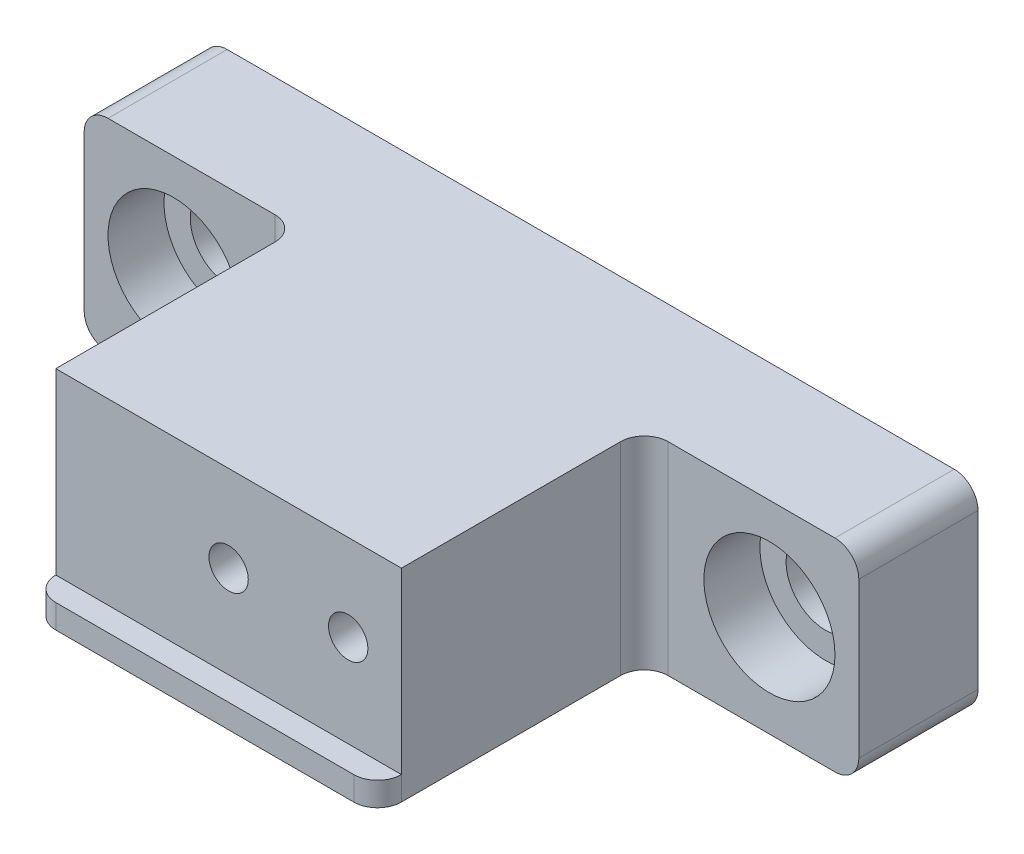
ISO-10303-21;
HEADER;
FILE_DESCRIPTION(('STEP AP214'),'2;1');
FILE_NAME('part.step','',(''),(''),'','','');
FILE_SCHEMA(('AUTOMOTIVE_DESIGN { 1 0 10303 214 1 1 1 1 }'));
ENDSEC;
DATA;
#1=APPLICATION_CONTEXT('core data for automotive mechanical design processes');
#2=APPLICATION_PROTOCOL_DEFINITION('international standard','automotive_design',2000,#1);
#3=PRODUCT_CONTEXT('',#1,'mechanical');
#4=PRODUCT('Part','Part','',(#3));
#5=PRODUCT_RELATED_PRODUCT_CATEGORY('part','',(#4));
#6=PRODUCT_DEFINITION_FORMATION('','',#4);
#7=PRODUCT_DEFINITION_CONTEXT('part definition',#1,'design');
#8=PRODUCT_DEFINITION('design','',#6,#7);
#9=PRODUCT_DEFINITION_SHAPE('','',#8);
#10=(LENGTH_UNIT() NAMED_UNIT(*) SI_UNIT(.MILLI.,.METRE.));
#11=(NAMED_UNIT(*) PLANE_ANGLE_UNIT() SI_UNIT($,.RADIAN.));
#12=(NAMED_UNIT(*) SI_UNIT($,.STERADIAN.) SOLID_ANGLE_UNIT());
#13=UNCERTAINTY_MEASURE_WITH_UNIT(LENGTH_MEASURE(1.E-05),#10,'distance_accuracy_value','');
#14=(GEOMETRIC_REPRESENTATION_CONTEXT(3) GLOBAL_UNCERTAINTY_ASSIGNED_CONTEXT((#13)) GLOBAL_UNIT_ASSIGNED_CONTEXT((#10,
#11,#12)) REPRESENTATION_CONTEXT('',''));
#15=CARTESIAN_POINT('',(0.,0.,0.));
#16=DIRECTION('',(0.,0.,1.));
#17=DIRECTION('',(1.,0.,0.));
#18=AXIS2_PLACEMENT_3D('',#15,#16,#17);
#19=CARTESIAN_POINT('',(0.,0.,10.));
#20=DIRECTION('',(0.,0.,1.));
#21=DIRECTION('',(1.,0.,0.));
#22=AXIS2_PLACEMENT_3D('',#19,#20,#21);
#23=PLANE('',#22);
#24=CARTESIAN_POINT('',(10.033,-5.25299999999997,10.));
#25=DIRECTION('',(0.,0.,1.));
#26=DIRECTION('',(1.,0.,0.));
#27=AXIS2_PLACEMENT_3D('',#24,#25,#26);
#28=CIRCLE('',#27,1.65);
#29=CARTESIAN_POINT('',(11.683,-5.25299999999997,10.));
#30=VERTEX_POINT('',#29);
#31=EDGE_CURVE('E214',#30,#30,#28,.T.);
#32=ORIENTED_EDGE('',*,*,#31,.F.);
#33=EDGE_LOOP('',(#32));
#34=FACE_BOUND('',#33,.T.);
#35=CARTESIAN_POINT('',(0.,-5.25299999999997,10.));
#36=DIRECTION('',(0.,0.,1.));
#37=DIRECTION('',(1.,0.,0.));
#38=AXIS2_PLACEMENT_3D('',#35,#36,#37);
#39=CIRCLE('',#38,1.65);
#40=CARTESIAN_POINT('',(1.65,-5.25299999999997,10.));
#41=VERTEX_POINT('',#40);
#42=EDGE_CURVE('E213',#41,#41,#39,.T.);
#43=ORIENTED_EDGE('',*,*,#42,.F.);
#44=EDGE_LOOP('',(#43));
#45=FACE_BOUND('',#44,.T.);
#46=DIRECTION('',(0.,1.,0.));
#47=VECTOR('',#46,1.);
#48=CARTESIAN_POINT('',(-14.5,-15.,10.));
#49=LINE('',#48,#47);
#50=CARTESIAN_POINT('',(-14.5,-13.,10.));
#51=VERTEX_POINT('',#50);
#52=CARTESIAN_POINT('',(-14.5,2.,10.));
#53=VERTEX_POINT('',#52);
#54=EDGE_CURVE('E306',#51,#53,#49,.T.);
#55=ORIENTED_EDGE('',*,*,#54,.F.);
#56=DIRECTION('',(1.,0.,0.));
#57=VECTOR('',#56,1.);
#58=CARTESIAN_POINT('',(-14.5,-13.,10.));
#59=LINE('',#58,#57);
#60=CARTESIAN_POINT('',(14.5,-13.,10.));
#61=VERTEX_POINT('',#60);
#62=EDGE_CURVE('E225',#51,#61,#59,.T.);
#63=ORIENTED_EDGE('',*,*,#62,.T.);
#64=DIRECTION('',(0.,-1.,0.));
#65=VECTOR('',#64,1.);
#66=CARTESIAN_POINT('',(14.5,-15.,10.));
#67=LINE('',#66,#65);
#68=CARTESIAN_POINT('',(14.5,2.,10.));
#69=VERTEX_POINT('',#68);
#70=EDGE_CURVE('E298',#69,#61,#67,.T.);
#71=ORIENTED_EDGE('',*,*,#70,.F.);
#72=DIRECTION('',(-1.,0.,0.));
#73=VECTOR('',#72,1.);
#74=CARTESIAN_POINT('',(32.5,2.00000000000001,10.));
#75=LINE('',#74,#73);
#76=EDGE_CURVE('E231',#69,#53,#75,.T.);
#77=ORIENTED_EDGE('',*,*,#76,.T.);
#78=EDGE_LOOP('',(#55,#63,#71,#77));
#79=FACE_BOUND('',#78,.T.);
#80=ADVANCED_FACE('F54',(#34,#45,#79),#23,.T.);
#81=CARTESIAN_POINT('',(32.5,0.,10.));
#82=DIRECTION('',(1.,0.,0.));
#83=DIRECTION('',(0.,0.,-1.));
#84=AXIS2_PLACEMENT_3D('',#81,#82,#83);
#85=PLANE('',#84);
#86=DIRECTION('',(0.,1.,0.));
#87=VECTOR('',#86,1.);
#88=CARTESIAN_POINT('',(32.5,-15.,-20.38));
#89=LINE('',#88,#87);
#90=CARTESIAN_POINT('',(32.5,-13.,-20.38));
#91=VERTEX_POINT('',#90);
#92=CARTESIAN_POINT('',(32.5,0.,-20.38));
#93=VERTEX_POINT('',#92);
#94=EDGE_CURVE('E314',#91,#93,#89,.T.);
#95=ORIENTED_EDGE('',*,*,#94,.T.);
#96=DIRECTION('',(0.,0.,1.));
#97=VECTOR('',#96,1.);
#98=CARTESIAN_POINT('',(32.5,0.,10.));
#99=LINE('',#98,#97);
#100=CARTESIAN_POINT('',(32.5,0.,-10.38));
#101=VERTEX_POINT('',#100);
#102=EDGE_CURVE('E342',#93,#101,#99,.T.);
#103=ORIENTED_EDGE('',*,*,#102,.T.);
#104=DIRECTION('',(0.,-1.,0.));
#105=VECTOR('',#104,1.);
#106=CARTESIAN_POINT('',(32.5,-15.,-10.38));
#107=LINE('',#106,#105);
#108=CARTESIAN_POINT('',(32.5,-13.,-10.38));
#109=VERTEX_POINT('',#108);
#110=EDGE_CURVE('E310',#101,#109,#107,.T.);
#111=ORIENTED_EDGE('',*,*,#110,.T.);
#112=DIRECTION('',(0.,0.,-1.));
#113=VECTOR('',#112,1.);
#114=CARTESIAN_POINT('',(32.5,-13.,-20.38));
#115=LINE('',#114,#113);
#116=EDGE_CURVE('E339',#109,#91,#115,.T.);
#117=ORIENTED_EDGE('',*,*,#116,.T.);
#118=EDGE_LOOP('',(#95,#103,#111,#117));
#119=FACE_BOUND('',#118,.T.);
#120=ADVANCED_FACE('F489',(#119),#85,.T.);
#121=CARTESIAN_POINT('',(-32.5,0.,10.));
#122=DIRECTION('',(1.,0.,0.));
#123=DIRECTION('',(0.,0.,-1.));
#124=AXIS2_PLACEMENT_3D('',#121,#122,#123);
#125=PLANE('',#124);
#126=DIRECTION('',(0.,1.,0.));
#127=VECTOR('',#126,1.);
#128=CARTESIAN_POINT('',(-32.5,-15.,-10.38));
#129=LINE('',#128,#127);
#130=CARTESIAN_POINT('',(-32.5,-13.,-10.38));
#131=VERTEX_POINT('',#130);
#132=CARTESIAN_POINT('',(-32.5,0.,-10.38));
#133=VERTEX_POINT('',#132);
#134=EDGE_CURVE('E301',#131,#133,#129,.T.);
#135=ORIENTED_EDGE('',*,*,#134,.T.);
#136=DIRECTION('',(0.,0.,1.));
#137=VECTOR('',#136,1.);
#138=CARTESIAN_POINT('',(-32.5,0.,-20.38));
#139=LINE('',#138,#137);
#140=CARTESIAN_POINT('',(-32.5,0.,-20.38));
#141=VERTEX_POINT('',#140);
#142=EDGE_CURVE('E375',#133,#141,#139,.F.);
#143=ORIENTED_EDGE('',*,*,#142,.T.);
#144=DIRECTION('',(0.,-1.,0.));
#145=VECTOR('',#144,1.);
#146=CARTESIAN_POINT('',(-32.5,-15.,-20.38));
#147=LINE('',#146,#145);
#148=CARTESIAN_POINT('',(-32.5,-13.,-20.38));
#149=VERTEX_POINT('',#148);
#150=EDGE_CURVE('E333',#141,#149,#147,.T.);
#151=ORIENTED_EDGE('',*,*,#150,.T.);
#152=DIRECTION('',(0.,0.,-1.));
#153=VECTOR('',#152,1.);
#154=CARTESIAN_POINT('',(-32.5,-13.,10.));
#155=LINE('',#154,#153);
#156=EDGE_CURVE('E373',#149,#131,#155,.F.);
#157=ORIENTED_EDGE('',*,*,#156,.T.);
#158=EDGE_LOOP('',(#135,#143,#151,#157));
#159=FACE_BOUND('',#158,.T.);
#160=ADVANCED_FACE('F448',(#159),#125,.F.);
#161=CARTESIAN_POINT('',(0.,-15.,10.));
#162=DIRECTION('',(0.,1.,0.));
#163=DIRECTION('',(0.,0.,1.));
#164=AXIS2_PLACEMENT_3D('',#161,#162,#163);
#165=PLANE('',#164);
#166=DIRECTION('',(-1.,0.,0.));
#167=VECTOR('',#166,1.);
#168=CARTESIAN_POINT('',(32.5,-15.,-10.38));
#169=LINE('',#168,#167);
#170=CARTESIAN_POINT('',(30.5,-15.,-10.38));
#171=VERTEX_POINT('',#170);
#172=CARTESIAN_POINT('',(16.5,-15.,-10.38));
#173=VERTEX_POINT('',#172);
#174=EDGE_CURVE('E317',#171,#173,#169,.T.);
#175=ORIENTED_EDGE('',*,*,#174,.T.);
#176=CARTESIAN_POINT('',(16.5,-15.,-8.38));
#177=DIRECTION('',(0.,1.,0.));
#178=DIRECTION('',(0.,0.,1.));
#179=AXIS2_PLACEMENT_3D('',#176,#177,#178);
#180=CIRCLE('',#179,2.);
#181=CARTESIAN_POINT('',(14.5,-15.,-8.38));
#182=VERTEX_POINT('',#181);
#183=EDGE_CURVE('E407',#173,#182,#180,.T.);
#184=ORIENTED_EDGE('',*,*,#183,.T.);
#185=DIRECTION('',(0.,0.,1.));
#186=VECTOR('',#185,1.);
#187=CARTESIAN_POINT('',(14.5,-15.,-45.1388368062799));
#188=LINE('',#187,#186);
#189=CARTESIAN_POINT('',(14.5,-15.,10.));
#190=VERTEX_POINT('',#189);
#191=EDGE_CURVE('E318',#182,#190,#188,.T.);
#192=ORIENTED_EDGE('',*,*,#191,.T.);
#193=CARTESIAN_POINT('',(12.5,-15.,10.));
#194=DIRECTION('',(0.,1.,0.));
#195=DIRECTION('',(0.,0.,1.));
#196=AXIS2_PLACEMENT_3D('',#193,#194,#195);
#197=CIRCLE('',#196,2.);
#198=CARTESIAN_POINT('',(12.5,-15.,12.));
#199=VERTEX_POINT('',#198);
#200=EDGE_CURVE('E383',#190,#199,#197,.F.);
#201=ORIENTED_EDGE('',*,*,#200,.T.);
#202=DIRECTION('',(-1.,0.,0.));
#203=VECTOR('',#202,1.);
#204=CARTESIAN_POINT('',(-14.5,-15.,12.));
#205=LINE('',#204,#203);
#206=CARTESIAN_POINT('',(-12.5,-15.,12.));
#207=VERTEX_POINT('',#206);
#208=EDGE_CURVE('E224',#199,#207,#205,.T.);
#209=ORIENTED_EDGE('',*,*,#208,.T.);
#210=CARTESIAN_POINT('',(-12.5,-15.,10.));
#211=DIRECTION('',(0.,1.,0.));
#212=DIRECTION('',(0.,0.,1.));
#213=AXIS2_PLACEMENT_3D('',#210,#211,#212);
#214=CIRCLE('',#213,2.);
#215=CARTESIAN_POINT('',(-14.5,-15.,10.));
#216=VERTEX_POINT('',#215);
#217=EDGE_CURVE('E380',#207,#216,#214,.F.);
#218=ORIENTED_EDGE('',*,*,#217,.T.);
#219=DIRECTION('',(0.,0.,1.));
#220=VECTOR('',#219,1.);
#221=CARTESIAN_POINT('',(-14.5,-15.,-45.1388368062799));
#222=LINE('',#221,#220);
#223=CARTESIAN_POINT('',(-14.5,-15.,-8.38));
#224=VERTEX_POINT('',#223);
#225=EDGE_CURVE('E309',#224,#216,#222,.T.);
#226=ORIENTED_EDGE('',*,*,#225,.F.);
#227=CARTESIAN_POINT('',(-16.5,-15.,-8.38));
#228=DIRECTION('',(0.,1.,0.));
#229=DIRECTION('',(0.,0.,1.));
#230=AXIS2_PLACEMENT_3D('',#227,#228,#229);
#231=CIRCLE('',#230,2.);
#232=CARTESIAN_POINT('',(-16.5,-15.,-10.38));
#233=VERTEX_POINT('',#232);
#234=EDGE_CURVE('E62',#224,#233,#231,.T.);
#235=ORIENTED_EDGE('',*,*,#234,.T.);
#236=DIRECTION('',(-1.,0.,0.));
#237=VECTOR('',#236,1.);
#238=CARTESIAN_POINT('',(-32.5,-15.,-10.38));
#239=LINE('',#238,#237);
#240=CARTESIAN_POINT('',(-30.5,-15.,-10.38));
#241=VERTEX_POINT('',#240);
#242=EDGE_CURVE('E305',#233,#241,#239,.T.);
#243=ORIENTED_EDGE('',*,*,#242,.T.);
#244=DIRECTION('',(0.,0.,-1.));
#245=VECTOR('',#244,1.);
#246=CARTESIAN_POINT('',(-30.5,-15.,10.));
#247=LINE('',#246,#245);
#248=CARTESIAN_POINT('',(-30.5,-15.,-20.38));
#249=VERTEX_POINT('',#248);
#250=EDGE_CURVE('E363',#241,#249,#247,.T.);
#251=ORIENTED_EDGE('',*,*,#250,.T.);
#252=DIRECTION('',(1.,0.,0.));
#253=VECTOR('',#252,1.);
#254=CARTESIAN_POINT('',(32.5,-15.,-20.38));
#255=LINE('',#254,#253);
#256=CARTESIAN_POINT('',(30.5,-15.,-20.38));
#257=VERTEX_POINT('',#256);
#258=EDGE_CURVE('E336',#249,#257,#255,.T.);
#259=ORIENTED_EDGE('',*,*,#258,.T.);
#260=DIRECTION('',(0.,0.,-1.));
#261=VECTOR('',#260,1.);
#262=CARTESIAN_POINT('',(30.5,-15.,-10.38));
#263=LINE('',#262,#261);
#264=EDGE_CURVE('E366',#257,#171,#263,.F.);
#265=ORIENTED_EDGE('',*,*,#264,.T.);
#266=EDGE_LOOP('',(#175,#184,#192,#201,#209,#218,#226,#235,#243,#251,#259,#265));
#267=FACE_BOUND('',#266,.T.);
#268=ADVANCED_FACE('F410',(#267),#165,.F.);
#269=CARTESIAN_POINT('',(32.5,2.,-20.38));
#270=DIRECTION('',(0.,1.,0.));
#271=DIRECTION('',(-1.,0.,0.));
#272=AXIS2_PLACEMENT_3D('',#269,#270,#271);
#273=PLANE('',#272);
#274=DIRECTION('',(0.,0.,1.));
#275=VECTOR('',#274,1.);
#276=CARTESIAN_POINT('',(14.5,2.,-45.1388368062799));
#277=LINE('',#276,#275);
#278=CARTESIAN_POINT('',(14.5,2.,-8.38));
#279=VERTEX_POINT('',#278);
#280=EDGE_CURVE('E323',#279,#69,#277,.T.);
#281=ORIENTED_EDGE('',*,*,#280,.F.);
#282=CARTESIAN_POINT('',(16.5,2.,-8.38));
#283=DIRECTION('',(0.,1.,0.));
#284=DIRECTION('',(-1.,0.,0.));
#285=AXIS2_PLACEMENT_3D('',#282,#283,#284);
#286=CIRCLE('',#285,2.);
#287=CARTESIAN_POINT('',(16.5,2.,-10.38));
#288=VERTEX_POINT('',#287);
#289=EDGE_CURVE('E405',#279,#288,#286,.F.);
#290=ORIENTED_EDGE('',*,*,#289,.T.);
#291=DIRECTION('',(1.,0.,0.));
#292=VECTOR('',#291,1.);
#293=CARTESIAN_POINT('',(32.5,2.00000000000001,-10.38));
#294=LINE('',#293,#292);
#295=CARTESIAN_POINT('',(30.5,2.00000000000001,-10.38));
#296=VERTEX_POINT('',#295);
#297=EDGE_CURVE('E315',#288,#296,#294,.T.);
#298=ORIENTED_EDGE('',*,*,#297,.T.);
#299=DIRECTION('',(0.,0.,1.));
#300=VECTOR('',#299,1.);
#301=CARTESIAN_POINT('',(30.5,2.,-20.38));
#302=LINE('',#301,#300);
#303=CARTESIAN_POINT('',(30.5,2.,-20.38));
#304=VERTEX_POINT('',#303);
#305=EDGE_CURVE('E353',#296,#304,#302,.F.);
#306=ORIENTED_EDGE('',*,*,#305,.T.);
#307=DIRECTION('',(-1.,0.,0.));
#308=VECTOR('',#307,1.);
#309=CARTESIAN_POINT('',(32.5,2.,-20.38));
#310=LINE('',#309,#308);
#311=CARTESIAN_POINT('',(-30.5,1.99999999999999,-20.38));
#312=VERTEX_POINT('',#311);
#313=EDGE_CURVE('E330',#304,#312,#310,.T.);
#314=ORIENTED_EDGE('',*,*,#313,.T.);
#315=DIRECTION('',(0.,0.,1.));
#316=VECTOR('',#315,1.);
#317=CARTESIAN_POINT('',(-30.5,1.99999999999999,-10.38));
#318=LINE('',#317,#316);
#319=CARTESIAN_POINT('',(-30.5,2.,-10.38));
#320=VERTEX_POINT('',#319);
#321=EDGE_CURVE('E350',#312,#320,#318,.T.);
#322=ORIENTED_EDGE('',*,*,#321,.T.);
#323=DIRECTION('',(1.,0.,0.));
#324=VECTOR('',#323,1.);
#325=CARTESIAN_POINT('',(-32.5,2.,-10.38));
#326=LINE('',#325,#324);
#327=CARTESIAN_POINT('',(-16.5,2.,-10.38));
#328=VERTEX_POINT('',#327);
#329=EDGE_CURVE('E299',#320,#328,#326,.T.);
#330=ORIENTED_EDGE('',*,*,#329,.T.);
#331=CARTESIAN_POINT('',(-16.5,1.99999999999999,-8.38));
#332=DIRECTION('',(0.,1.,0.));
#333=DIRECTION('',(-1.,0.,0.));
#334=AXIS2_PLACEMENT_3D('',#331,#332,#333);
#335=CIRCLE('',#334,2.);
#336=CARTESIAN_POINT('',(-14.5,2.,-8.38));
#337=VERTEX_POINT('',#336);
#338=EDGE_CURVE('E14',#328,#337,#335,.F.);
#339=ORIENTED_EDGE('',*,*,#338,.T.);
#340=DIRECTION('',(0.,0.,1.));
#341=VECTOR('',#340,1.);
#342=CARTESIAN_POINT('',(-14.5,2.,-45.1388368062799));
#343=LINE('',#342,#341);
#344=EDGE_CURVE('E302',#337,#53,#343,.T.);
#345=ORIENTED_EDGE('',*,*,#344,.T.);
#346=ORIENTED_EDGE('',*,*,#76,.F.);
#347=EDGE_LOOP('',(#281,#290,#298,#306,#314,#322,#330,#339,#345,#346));
#348=FACE_BOUND('',#347,.T.);
#349=ADVANCED_FACE('F423',(#348),#273,.T.);
#350=CARTESIAN_POINT('',(0.,0.,-20.38));
#351=DIRECTION('',(0.,0.,1.));
#352=DIRECTION('',(1.,0.,0.));
#353=AXIS2_PLACEMENT_3D('',#350,#351,#352);
#354=PLANE('',#353);
#355=DIRECTION('',(-1.,0.,0.));
#356=VECTOR('',#355,1.);
#357=CARTESIAN_POINT('',(-14.5,-8.5,-20.38));
#358=LINE('',#357,#356);
#359=CARTESIAN_POINT('',(-14.5,-8.5,-20.38));
#360=VERTEX_POINT('',#359);
#361=CARTESIAN_POINT('',(-15.5,-8.5,-20.38));
#362=VERTEX_POINT('',#361);
#363=EDGE_CURVE('E252',#360,#362,#358,.T.);
#364=ORIENTED_EDGE('',*,*,#363,.F.);
#365=CARTESIAN_POINT('',(-14.5,-6.5,-20.38));
#366=DIRECTION('',(0.,0.,-1.));
#367=DIRECTION('',(-1.,0.,0.));
#368=AXIS2_PLACEMENT_3D('',#365,#366,#367);
#369=CIRCLE('',#368,2.);
#370=CARTESIAN_POINT('',(-14.5,-4.5,-20.38));
#371=VERTEX_POINT('',#370);
#372=EDGE_CURVE('E236',#371,#360,#369,.T.);
#373=ORIENTED_EDGE('',*,*,#372,.F.);
#374=DIRECTION('',(1.,0.,0.));
#375=VECTOR('',#374,1.);
#376=CARTESIAN_POINT('',(-14.5,-4.5,-20.38));
#377=LINE('',#376,#375);
#378=CARTESIAN_POINT('',(-15.5,-4.5,-20.38));
#379=VERTEX_POINT('',#378);
#380=EDGE_CURVE('E241',#379,#371,#377,.T.);
#381=ORIENTED_EDGE('',*,*,#380,.F.);
#382=CARTESIAN_POINT('',(-15.5,-6.5,-20.38));
#383=DIRECTION('',(0.,0.,-1.));
#384=DIRECTION('',(-1.,0.,0.));
#385=AXIS2_PLACEMENT_3D('',#382,#383,#384);
#386=CIRCLE('',#385,2.);
#387=EDGE_CURVE('E255',#362,#379,#386,.T.);
#388=ORIENTED_EDGE('',*,*,#387,.F.);
#389=EDGE_LOOP('',(#364,#373,#381,#388));
#390=FACE_BOUND('',#389,.T.);
#391=CARTESIAN_POINT('',(15.,-6.5,-20.38));
#392=DIRECTION('',(0.,0.,-1.));
#393=DIRECTION('',(-1.,0.,0.));
#394=AXIS2_PLACEMENT_3D('',#391,#392,#393);
#395=CIRCLE('',#394,2.);
#396=CARTESIAN_POINT('',(13.,-6.5,-20.38));
#397=VERTEX_POINT('',#396);
#398=EDGE_CURVE('E262',#397,#397,#395,.T.);
#399=ORIENTED_EDGE('',*,*,#398,.F.);
#400=EDGE_LOOP('',(#399));
#401=FACE_BOUND('',#400,.T.);
#402=CARTESIAN_POINT('',(-25.,-6.50000000000001,-20.38));
#403=DIRECTION('',(0.,0.,1.));
#404=DIRECTION('',(1.,0.,0.));
#405=AXIS2_PLACEMENT_3D('',#402,#403,#404);
#406=CIRCLE('',#405,3.3);
#407=CARTESIAN_POINT('',(-21.7,-6.50000000000001,-20.38));
#408=VERTEX_POINT('',#407);
#409=EDGE_CURVE('E283',#408,#408,#406,.T.);
#410=ORIENTED_EDGE('',*,*,#409,.T.);
#411=EDGE_LOOP('',(#410));
#412=FACE_BOUND('',#411,.T.);
#413=CARTESIAN_POINT('',(25.,-6.5,-20.38));
#414=DIRECTION('',(0.,0.,1.));
#415=DIRECTION('',(1.,0.,0.));
#416=AXIS2_PLACEMENT_3D('',#413,#414,#415);
#417=CIRCLE('',#416,3.3);
#418=CARTESIAN_POINT('',(28.3,-6.5,-20.38));
#419=VERTEX_POINT('',#418);
#420=EDGE_CURVE('E295',#419,#419,#417,.T.);
#421=ORIENTED_EDGE('',*,*,#420,.T.);
#422=EDGE_LOOP('',(#421));
#423=FACE_BOUND('',#422,.T.);
#424=ORIENTED_EDGE('',*,*,#313,.F.);
#425=CARTESIAN_POINT('',(30.5,0.,-20.38));
#426=DIRECTION('',(0.,0.,1.));
#427=DIRECTION('',(1.,0.,0.));
#428=AXIS2_PLACEMENT_3D('',#425,#426,#427);
#429=CIRCLE('',#428,2.);
#430=EDGE_CURVE('E361',#304,#93,#429,.F.);
#431=ORIENTED_EDGE('',*,*,#430,.T.);
#432=ORIENTED_EDGE('',*,*,#94,.F.);
#433=CARTESIAN_POINT('',(30.5,-13.,-20.38));
#434=DIRECTION('',(0.,0.,1.));
#435=DIRECTION('',(1.,0.,0.));
#436=AXIS2_PLACEMENT_3D('',#433,#434,#435);
#437=CIRCLE('',#436,2.);
#438=EDGE_CURVE('E359',#91,#257,#437,.F.);
#439=ORIENTED_EDGE('',*,*,#438,.T.);
#440=ORIENTED_EDGE('',*,*,#258,.F.);
#441=CARTESIAN_POINT('',(-30.5,-13.,-20.38));
#442=DIRECTION('',(0.,0.,1.));
#443=DIRECTION('',(1.,0.,0.));
#444=AXIS2_PLACEMENT_3D('',#441,#442,#443);
#445=CIRCLE('',#444,2.);
#446=EDGE_CURVE('E355',#249,#149,#445,.F.);
#447=ORIENTED_EDGE('',*,*,#446,.T.);
#448=ORIENTED_EDGE('',*,*,#150,.F.);
#449=CARTESIAN_POINT('',(-30.5,0.,-20.38));
#450=DIRECTION('',(0.,0.,1.));
#451=DIRECTION('',(1.,0.,0.));
#452=AXIS2_PLACEMENT_3D('',#449,#450,#451);
#453=CIRCLE('',#452,2.);
#454=EDGE_CURVE('E357',#141,#312,#453,.F.);
#455=ORIENTED_EDGE('',*,*,#454,.T.);
#456=EDGE_LOOP('',(#424,#431,#432,#439,#440,#447,#448,#455));
#457=FACE_BOUND('',#456,.T.);
#458=ADVANCED_FACE('F436',(#390,#401,#412,#423,#457),#354,.F.);
#459=CARTESIAN_POINT('',(14.5,-15.,-45.1388368062799));
#460=DIRECTION('',(-1.,0.,0.));
#461=DIRECTION('',(0.,-1.,0.));
#462=AXIS2_PLACEMENT_3D('',#459,#460,#461);
#463=PLANE('',#462);
#464=ORIENTED_EDGE('',*,*,#191,.F.);
#465=DIRECTION('',(0.,1.,0.));
#466=VECTOR('',#465,1.);
#467=CARTESIAN_POINT('',(14.5,-15.,-8.38));
#468=LINE('',#467,#466);
#469=EDGE_CURVE('E396',#182,#279,#468,.T.);
#470=ORIENTED_EDGE('',*,*,#469,.T.);
#471=ORIENTED_EDGE('',*,*,#280,.T.);
#472=ORIENTED_EDGE('',*,*,#70,.T.);
#473=DIRECTION('',(0.,-1.,0.));
#474=VECTOR('',#473,1.);
#475=CARTESIAN_POINT('',(14.5,-15.,10.));
#476=LINE('',#475,#474);
#477=EDGE_CURVE('E377',#61,#190,#476,.T.);
#478=ORIENTED_EDGE('',*,*,#477,.T.);
#479=EDGE_LOOP('',(#464,#470,#471,#472,#478));
#480=FACE_BOUND('',#479,.T.);
#481=ADVANCED_FACE('F417',(#480),#463,.F.);
#482=CARTESIAN_POINT('',(0.,0.,-10.38));
#483=DIRECTION('',(0.,0.,1.));
#484=DIRECTION('',(1.,0.,0.));
#485=AXIS2_PLACEMENT_3D('',#482,#483,#484);
#486=PLANE('',#485);
#487=CARTESIAN_POINT('',(25.,-6.5,-10.38));
#488=DIRECTION('',(0.,0.,1.));
#489=DIRECTION('',(1.,0.,0.));
#490=AXIS2_PLACEMENT_3D('',#487,#488,#489);
#491=CIRCLE('',#490,5.5);
#492=CARTESIAN_POINT('',(30.5,-6.5,-10.38));
#493=VERTEX_POINT('',#492);
#494=EDGE_CURVE('E286',#493,#493,#491,.T.);
#495=ORIENTED_EDGE('',*,*,#494,.F.);
#496=EDGE_LOOP('',(#495));
#497=FACE_BOUND('',#496,.T.);
#498=ORIENTED_EDGE('',*,*,#297,.F.);
#499=DIRECTION('',(0.,1.,0.));
#500=VECTOR('',#499,1.);
#501=CARTESIAN_POINT('',(16.5,0.,-10.38));
#502=LINE('',#501,#500);
#503=EDGE_CURVE('E399',#288,#173,#502,.F.);
#504=ORIENTED_EDGE('',*,*,#503,.T.);
#505=ORIENTED_EDGE('',*,*,#174,.F.);
#506=CARTESIAN_POINT('',(30.5,-13.,-10.38));
#507=DIRECTION('',(0.,0.,1.));
#508=DIRECTION('',(1.,0.,0.));
#509=AXIS2_PLACEMENT_3D('',#506,#507,#508);
#510=CIRCLE('',#509,2.);
#511=EDGE_CURVE('E345',#171,#109,#510,.T.);
#512=ORIENTED_EDGE('',*,*,#511,.T.);
#513=ORIENTED_EDGE('',*,*,#110,.F.);
#514=CARTESIAN_POINT('',(30.5,0.,-10.38));
#515=DIRECTION('',(0.,0.,1.));
#516=DIRECTION('',(1.,0.,0.));
#517=AXIS2_PLACEMENT_3D('',#514,#515,#516);
#518=CIRCLE('',#517,2.);
#519=EDGE_CURVE('E347',#101,#296,#518,.T.);
#520=ORIENTED_EDGE('',*,*,#519,.T.);
#521=EDGE_LOOP('',(#498,#504,#505,#512,#513,#520));
#522=FACE_BOUND('',#521,.T.);
#523=ADVANCED_FACE('F426',(#497,#522),#486,.T.);
#524=CARTESIAN_POINT('',(-14.5,-15.,-45.1388368062799));
#525=DIRECTION('',(1.,0.,0.));
#526=DIRECTION('',(0.,1.,0.));
#527=AXIS2_PLACEMENT_3D('',#524,#525,#526);
#528=PLANE('',#527);
#529=ORIENTED_EDGE('',*,*,#344,.F.);
#530=DIRECTION('',(0.,-1.,0.));
#531=VECTOR('',#530,1.);
#532=CARTESIAN_POINT('',(-14.5,-15.,-8.38));
#533=LINE('',#532,#531);
#534=EDGE_CURVE('E401',#337,#224,#533,.T.);
#535=ORIENTED_EDGE('',*,*,#534,.T.);
#536=ORIENTED_EDGE('',*,*,#225,.T.);
#537=DIRECTION('',(0.,-1.,0.));
#538=VECTOR('',#537,1.);
#539=CARTESIAN_POINT('',(-14.5,-13.,10.));
#540=LINE('',#539,#538);
#541=EDGE_CURVE('E394',#216,#51,#540,.F.);
#542=ORIENTED_EDGE('',*,*,#541,.T.);
#543=ORIENTED_EDGE('',*,*,#54,.T.);
#544=EDGE_LOOP('',(#529,#535,#536,#542,#543));
#545=FACE_BOUND('',#544,.T.);
#546=ADVANCED_FACE('F457',(#545),#528,.F.);
#547=CARTESIAN_POINT('',(0.,0.,-10.38));
#548=DIRECTION('',(0.,0.,1.));
#549=DIRECTION('',(1.,0.,0.));
#550=AXIS2_PLACEMENT_3D('',#547,#548,#549);
#551=PLANE('',#550);
#552=CARTESIAN_POINT('',(-25.,-6.50000000000001,-10.38));
#553=DIRECTION('',(0.,0.,1.));
#554=DIRECTION('',(1.,0.,0.));
#555=AXIS2_PLACEMENT_3D('',#552,#553,#554);
#556=CIRCLE('',#555,5.5);
#557=CARTESIAN_POINT('',(-19.5,-6.50000000000001,-10.38));
#558=VERTEX_POINT('',#557);
#559=EDGE_CURVE('E274',#558,#558,#556,.T.);
#560=ORIENTED_EDGE('',*,*,#559,.F.);
#561=EDGE_LOOP('',(#560));
#562=FACE_BOUND('',#561,.T.);
#563=ORIENTED_EDGE('',*,*,#242,.F.);
#564=DIRECTION('',(0.,-1.,0.));
#565=VECTOR('',#564,1.);
#566=CARTESIAN_POINT('',(-16.5,0.,-10.38));
#567=LINE('',#566,#565);
#568=EDGE_CURVE('E75',#233,#328,#567,.F.);
#569=ORIENTED_EDGE('',*,*,#568,.T.);
#570=ORIENTED_EDGE('',*,*,#329,.F.);
#571=CARTESIAN_POINT('',(-30.5,0.,-10.38));
#572=DIRECTION('',(0.,0.,1.));
#573=DIRECTION('',(1.,0.,0.));
#574=AXIS2_PLACEMENT_3D('',#571,#572,#573);
#575=CIRCLE('',#574,2.);
#576=EDGE_CURVE('E371',#320,#133,#575,.T.);
#577=ORIENTED_EDGE('',*,*,#576,.T.);
#578=ORIENTED_EDGE('',*,*,#134,.F.);
#579=CARTESIAN_POINT('',(-30.5,-13.,-10.38));
#580=DIRECTION('',(0.,0.,1.));
#581=DIRECTION('',(1.,0.,0.));
#582=AXIS2_PLACEMENT_3D('',#579,#580,#581);
#583=CIRCLE('',#582,2.);
#584=EDGE_CURVE('E368',#131,#241,#583,.T.);
#585=ORIENTED_EDGE('',*,*,#584,.T.);
#586=EDGE_LOOP('',(#563,#569,#570,#577,#578,#585));
#587=FACE_BOUND('',#586,.T.);
#588=ADVANCED_FACE('F444',(#562,#587),#551,.T.);
#589=CARTESIAN_POINT('',(25.,-6.5,-10.38));
#590=DIRECTION('',(0.,0.,1.));
#591=DIRECTION('',(1.,0.,0.));
#592=AXIS2_PLACEMENT_3D('',#589,#590,#591);
#593=CYLINDRICAL_SURFACE('',#592,3.3);
#594=ORIENTED_EDGE('',*,*,#420,.F.);
#595=EDGE_LOOP('',(#594));
#596=FACE_BOUND('',#595,.T.);
#597=CARTESIAN_POINT('',(25.,-6.5,-15.08));
#598=DIRECTION('',(0.,0.,1.));
#599=DIRECTION('',(1.,0.,0.));
#600=AXIS2_PLACEMENT_3D('',#597,#598,#599);
#601=CIRCLE('',#600,3.3);
#602=CARTESIAN_POINT('',(28.3,-6.5,-15.08));
#603=VERTEX_POINT('',#602);
#604=EDGE_CURVE('E292',#603,#603,#601,.T.);
#605=ORIENTED_EDGE('',*,*,#604,.T.);
#606=EDGE_LOOP('',(#605));
#607=FACE_BOUND('',#606,.T.);
#608=ADVANCED_FACE('F539',(#596,#607),#593,.F.);
#609=CARTESIAN_POINT('',(28.3,-6.5,-15.08));
#610=DIRECTION('',(0.,0.,-1.));
#611=DIRECTION('',(-1.,0.,0.));
#612=AXIS2_PLACEMENT_3D('',#609,#610,#611);
#613=PLANE('',#612);
#614=ORIENTED_EDGE('',*,*,#604,.F.);
#615=EDGE_LOOP('',(#614));
#616=FACE_BOUND('',#615,.T.);
#617=CARTESIAN_POINT('',(25.,-6.5,-15.08));
#618=DIRECTION('',(0.,0.,1.));
#619=DIRECTION('',(1.,0.,0.));
#620=AXIS2_PLACEMENT_3D('',#617,#618,#619);
#621=CIRCLE('',#620,5.5);
#622=CARTESIAN_POINT('',(30.5,-6.5,-15.08));
#623=VERTEX_POINT('',#622);
#624=EDGE_CURVE('E289',#623,#623,#621,.T.);
#625=ORIENTED_EDGE('',*,*,#624,.T.);
#626=EDGE_LOOP('',(#625));
#627=FACE_BOUND('',#626,.T.);
#628=ADVANCED_FACE('F801',(#616,#627),#613,.F.);
#629=CARTESIAN_POINT('',(25.,-6.5,-10.38));
#630=DIRECTION('',(0.,0.,1.));
#631=DIRECTION('',(1.,0.,0.));
#632=AXIS2_PLACEMENT_3D('',#629,#630,#631);
#633=CYLINDRICAL_SURFACE('',#632,5.5);
#634=ORIENTED_EDGE('',*,*,#624,.F.);
#635=EDGE_LOOP('',(#634));
#636=FACE_BOUND('',#635,.T.);
#637=ORIENTED_EDGE('',*,*,#494,.T.);
#638=EDGE_LOOP('',(#637));
#639=FACE_BOUND('',#638,.T.);
#640=ADVANCED_FACE('F791',(#636,#639),#633,.F.);
#641=CARTESIAN_POINT('',(-25.,-6.50000000000001,-10.38));
#642=DIRECTION('',(0.,0.,1.));
#643=DIRECTION('',(1.,0.,0.));
#644=AXIS2_PLACEMENT_3D('',#641,#642,#643);
#645=CYLINDRICAL_SURFACE('',#644,3.3);
#646=ORIENTED_EDGE('',*,*,#409,.F.);
#647=EDGE_LOOP('',(#646));
#648=FACE_BOUND('',#647,.T.);
#649=CARTESIAN_POINT('',(-25.,-6.50000000000001,-15.08));
#650=DIRECTION('',(0.,0.,1.));
#651=DIRECTION('',(1.,0.,0.));
#652=AXIS2_PLACEMENT_3D('',#649,#650,#651);
#653=CIRCLE('',#652,3.3);
#654=CARTESIAN_POINT('',(-21.7,-6.50000000000001,-15.08));
#655=VERTEX_POINT('',#654);
#656=EDGE_CURVE('E280',#655,#655,#653,.T.);
#657=ORIENTED_EDGE('',*,*,#656,.T.);
#658=EDGE_LOOP('',(#657));
#659=FACE_BOUND('',#658,.T.);
#660=ADVANCED_FACE('F781',(#648,#659),#645,.F.);
#661=CARTESIAN_POINT('',(-21.7,-6.50000000000001,-15.08));
#662=DIRECTION('',(0.,0.,-1.));
#663=DIRECTION('',(-1.,0.,0.));
#664=AXIS2_PLACEMENT_3D('',#661,#662,#663);
#665=PLANE('',#664);
#666=ORIENTED_EDGE('',*,*,#656,.F.);
#667=EDGE_LOOP('',(#666));
#668=FACE_BOUND('',#667,.T.);
#669=CARTESIAN_POINT('',(-25.,-6.50000000000001,-15.08));
#670=DIRECTION('',(0.,0.,1.));
#671=DIRECTION('',(1.,0.,0.));
#672=AXIS2_PLACEMENT_3D('',#669,#670,#671);
#673=CIRCLE('',#672,5.5);
#674=CARTESIAN_POINT('',(-19.5,-6.50000000000001,-15.08));
#675=VERTEX_POINT('',#674);
#676=EDGE_CURVE('E277',#675,#675,#673,.T.);
#677=ORIENTED_EDGE('',*,*,#676,.T.);
#678=EDGE_LOOP('',(#677));
#679=FACE_BOUND('',#678,.T.);
#680=ADVANCED_FACE('F771',(#668,#679),#665,.F.);
#681=CARTESIAN_POINT('',(-25.,-6.50000000000001,-10.38));
#682=DIRECTION('',(0.,0.,1.));
#683=DIRECTION('',(1.,0.,0.));
#684=AXIS2_PLACEMENT_3D('',#681,#682,#683);
#685=CYLINDRICAL_SURFACE('',#684,5.5);
#686=ORIENTED_EDGE('',*,*,#676,.F.);
#687=EDGE_LOOP('',(#686));
#688=FACE_BOUND('',#687,.T.);
#689=ORIENTED_EDGE('',*,*,#559,.T.);
#690=EDGE_LOOP('',(#689));
#691=FACE_BOUND('',#690,.T.);
#692=ADVANCED_FACE('F761',(#688,#691),#685,.F.);
#693=CARTESIAN_POINT('',(15.,-6.5,-15.38));
#694=DIRECTION('',(0.,0.,-1.));
#695=DIRECTION('',(-1.,0.,0.));
#696=AXIS2_PLACEMENT_3D('',#693,#694,#695);
#697=CONICAL_SURFACE('',#696,2.,1.02974425867665);
#698=CARTESIAN_POINT('',(15.,-6.5,-14.1782787619449));
#699=VERTEX_POINT('',#698);
#700=VERTEX_LOOP('',#699);
#701=FACE_BOUND('',#700,.T.);
#702=CARTESIAN_POINT('',(15.,-6.5,-15.38));
#703=DIRECTION('',(0.,0.,-1.));
#704=DIRECTION('',(-1.,0.,0.));
#705=AXIS2_PLACEMENT_3D('',#702,#703,#704);
#706=CIRCLE('',#705,2.);
#707=CARTESIAN_POINT('',(13.,-6.5,-15.38));
#708=VERTEX_POINT('',#707);
#709=EDGE_CURVE('E271',#708,#708,#706,.T.);
#710=ORIENTED_EDGE('',*,*,#709,.T.);
#711=EDGE_LOOP('',(#710));
#712=FACE_BOUND('',#711,.T.);
#713=ADVANCED_FACE('F751',(#701,#712),#697,.F.);
#714=CARTESIAN_POINT('',(15.,-6.5,-20.38));
#715=DIRECTION('',(0.,0.,-1.));
#716=DIRECTION('',(-1.,0.,0.));
#717=AXIS2_PLACEMENT_3D('',#714,#715,#716);
#718=CYLINDRICAL_SURFACE('',#717,2.);
#719=ORIENTED_EDGE('',*,*,#709,.F.);
#720=EDGE_LOOP('',(#719));
#721=FACE_BOUND('',#720,.T.);
#722=ORIENTED_EDGE('',*,*,#398,.T.);
#723=EDGE_LOOP('',(#722));
#724=FACE_BOUND('',#723,.T.);
#725=ADVANCED_FACE('F741',(#721,#724),#718,.F.);
#726=CARTESIAN_POINT('',(-14.5,-6.5,-15.38));
#727=DIRECTION('',(0.,0.,-1.));
#728=DIRECTION('',(-1.,0.,0.));
#729=AXIS2_PLACEMENT_3D('',#726,#727,#728);
#730=CYLINDRICAL_SURFACE('',#729,2.);
#731=ORIENTED_EDGE('',*,*,#372,.T.);
#732=DIRECTION('',(0.,0.,-1.));
#733=VECTOR('',#732,1.);
#734=CARTESIAN_POINT('',(-14.5,-8.5,-15.38));
#735=LINE('',#734,#733);
#736=CARTESIAN_POINT('',(-14.5,-8.5,-15.38));
#737=VERTEX_POINT('',#736);
#738=EDGE_CURVE('E250',#737,#360,#735,.T.);
#739=ORIENTED_EDGE('',*,*,#738,.F.);
#740=CARTESIAN_POINT('',(-14.5,-6.5,-15.38));
#741=DIRECTION('',(0.,0.,-1.));
#742=DIRECTION('',(-1.,0.,0.));
#743=AXIS2_PLACEMENT_3D('',#740,#741,#742);
#744=CIRCLE('',#743,2.);
#745=CARTESIAN_POINT('',(-14.5,-4.5,-15.38));
#746=VERTEX_POINT('',#745);
#747=EDGE_CURVE('E237',#746,#737,#744,.T.);
#748=ORIENTED_EDGE('',*,*,#747,.F.);
#749=DIRECTION('',(0.,0.,-1.));
#750=VECTOR('',#749,1.);
#751=CARTESIAN_POINT('',(-14.5,-4.5,-15.38));
#752=LINE('',#751,#750);
#753=EDGE_CURVE('E260',#746,#371,#752,.T.);
#754=ORIENTED_EDGE('',*,*,#753,.T.);
#755=EDGE_LOOP('',(#731,#739,#748,#754));
#756=FACE_BOUND('',#755,.T.);
#757=ADVANCED_FACE('F731',(#756),#730,.F.);
#758=CARTESIAN_POINT('',(-14.5,-4.5,-15.38));
#759=DIRECTION('',(0.,1.,0.));
#760=DIRECTION('',(0.,0.,1.));
#761=AXIS2_PLACEMENT_3D('',#758,#759,#760);
#762=PLANE('',#761);
#763=ORIENTED_EDGE('',*,*,#380,.T.);
#764=ORIENTED_EDGE('',*,*,#753,.F.);
#765=DIRECTION('',(1.,0.,0.));
#766=VECTOR('',#765,1.);
#767=CARTESIAN_POINT('',(-14.5,-4.5,-15.38));
#768=LINE('',#767,#766);
#769=CARTESIAN_POINT('',(-15.5,-4.5,-15.38));
#770=VERTEX_POINT('',#769);
#771=EDGE_CURVE('E247',#770,#746,#768,.T.);
#772=ORIENTED_EDGE('',*,*,#771,.F.);
#773=DIRECTION('',(0.,0.,-1.));
#774=VECTOR('',#773,1.);
#775=CARTESIAN_POINT('',(-15.5,-4.5,-15.38));
#776=LINE('',#775,#774);
#777=EDGE_CURVE('E263',#770,#379,#776,.T.);
#778=ORIENTED_EDGE('',*,*,#777,.T.);
#779=EDGE_LOOP('',(#763,#764,#772,#778));
#780=FACE_BOUND('',#779,.T.);
#781=ADVANCED_FACE('F721',(#780),#762,.F.);
#782=CARTESIAN_POINT('',(-15.5,-6.5,-15.38));
#783=DIRECTION('',(0.,0.,-1.));
#784=DIRECTION('',(-1.,0.,0.));
#785=AXIS2_PLACEMENT_3D('',#782,#783,#784);
#786=CYLINDRICAL_SURFACE('',#785,2.);
#787=ORIENTED_EDGE('',*,*,#387,.T.);
#788=ORIENTED_EDGE('',*,*,#777,.F.);
#789=CARTESIAN_POINT('',(-15.5,-6.5,-15.38));
#790=DIRECTION('',(0.,0.,-1.));
#791=DIRECTION('',(-1.,0.,0.));
#792=AXIS2_PLACEMENT_3D('',#789,#790,#791);
#793=CIRCLE('',#792,2.);
#794=CARTESIAN_POINT('',(-15.5,-8.5,-15.38));
#795=VERTEX_POINT('',#794);
#796=EDGE_CURVE('E244',#795,#770,#793,.T.);
#797=ORIENTED_EDGE('',*,*,#796,.F.);
#798=DIRECTION('',(0.,0.,-1.));
#799=VECTOR('',#798,1.);
#800=CARTESIAN_POINT('',(-15.5,-8.5,-15.38));
#801=LINE('',#800,#799);
#802=EDGE_CURVE('E265',#795,#362,#801,.T.);
#803=ORIENTED_EDGE('',*,*,#802,.T.);
#804=EDGE_LOOP('',(#787,#788,#797,#803));
#805=FACE_BOUND('',#804,.T.);
#806=ADVANCED_FACE('F711',(#805),#786,.F.);
#807=CARTESIAN_POINT('',(-14.5,-8.5,-15.38));
#808=DIRECTION('',(0.,-1.,0.));
#809=DIRECTION('',(0.,0.,-1.));
#810=AXIS2_PLACEMENT_3D('',#807,#808,#809);
#811=PLANE('',#810);
#812=ORIENTED_EDGE('',*,*,#363,.T.);
#813=ORIENTED_EDGE('',*,*,#802,.F.);
#814=DIRECTION('',(-1.,0.,0.));
#815=VECTOR('',#814,1.);
#816=CARTESIAN_POINT('',(-14.5,-8.5,-15.38));
#817=LINE('',#816,#815);
#818=EDGE_CURVE('E240',#737,#795,#817,.T.);
#819=ORIENTED_EDGE('',*,*,#818,.F.);
#820=ORIENTED_EDGE('',*,*,#738,.T.);
#821=EDGE_LOOP('',(#812,#813,#819,#820));
#822=FACE_BOUND('',#821,.T.);
#823=ADVANCED_FACE('F700',(#822),#811,.F.);
#824=CARTESIAN_POINT('',(-14.5,-6.5,-15.38));
#825=DIRECTION('',(0.,0.,-1.));
#826=DIRECTION('',(-1.,0.,0.));
#827=AXIS2_PLACEMENT_3D('',#824,#825,#826);
#828=PLANE('',#827);
#829=ORIENTED_EDGE('',*,*,#747,.T.);
#830=ORIENTED_EDGE('',*,*,#818,.T.);
#831=ORIENTED_EDGE('',*,*,#796,.T.);
#832=ORIENTED_EDGE('',*,*,#771,.T.);
#833=EDGE_LOOP('',(#829,#830,#831,#832));
#834=FACE_BOUND('',#833,.T.);
#835=ADVANCED_FACE('F486',(#834),#828,.T.);
#836=CARTESIAN_POINT('',(-14.5,-13.,12.));
#837=DIRECTION('',(0.,0.,1.));
#838=DIRECTION('',(1.,0.,0.));
#839=AXIS2_PLACEMENT_3D('',#836,#837,#838);
#840=PLANE('',#839);
#841=ORIENTED_EDGE('',*,*,#208,.F.);
#842=DIRECTION('',(0.,-1.,0.));
#843=VECTOR('',#842,1.);
#844=CARTESIAN_POINT('',(12.5,-13.,12.));
#845=LINE('',#844,#843);
#846=CARTESIAN_POINT('',(12.5,-13.,12.));
#847=VERTEX_POINT('',#846);
#848=EDGE_CURVE('E388',#199,#847,#845,.F.);
#849=ORIENTED_EDGE('',*,*,#848,.T.);
#850=DIRECTION('',(-1.,0.,0.));
#851=VECTOR('',#850,1.);
#852=CARTESIAN_POINT('',(-14.5,-13.,12.));
#853=LINE('',#852,#851);
#854=CARTESIAN_POINT('',(-12.5,-13.,12.));
#855=VERTEX_POINT('',#854);
#856=EDGE_CURVE('E228',#847,#855,#853,.T.);
#857=ORIENTED_EDGE('',*,*,#856,.T.);
#858=DIRECTION('',(0.,-1.,0.));
#859=VECTOR('',#858,1.);
#860=CARTESIAN_POINT('',(-12.5,-15.,12.));
#861=LINE('',#860,#859);
#862=EDGE_CURVE('E385',#855,#207,#861,.T.);
#863=ORIENTED_EDGE('',*,*,#862,.T.);
#864=EDGE_LOOP('',(#841,#849,#857,#863));
#865=FACE_BOUND('',#864,.T.);
#866=ADVANCED_FACE('F470',(#865),#840,.T.);
#867=CARTESIAN_POINT('',(0.,-13.,0.));
#868=DIRECTION('',(0.,1.,0.));
#869=DIRECTION('',(0.,0.,1.));
#870=AXIS2_PLACEMENT_3D('',#867,#868,#869);
#871=PLANE('',#870);
#872=ORIENTED_EDGE('',*,*,#856,.F.);
#873=CARTESIAN_POINT('',(12.5,-13.,10.));
#874=DIRECTION('',(0.,1.,0.));
#875=DIRECTION('',(0.,0.,1.));
#876=AXIS2_PLACEMENT_3D('',#873,#874,#875);
#877=CIRCLE('',#876,2.);
#878=EDGE_CURVE('E392',#847,#61,#877,.T.);
#879=ORIENTED_EDGE('',*,*,#878,.T.);
#880=ORIENTED_EDGE('',*,*,#62,.F.);
#881=CARTESIAN_POINT('',(-12.5,-13.,10.));
#882=DIRECTION('',(0.,1.,0.));
#883=DIRECTION('',(0.,0.,1.));
#884=AXIS2_PLACEMENT_3D('',#881,#882,#883);
#885=CIRCLE('',#884,2.);
#886=EDGE_CURVE('E390',#51,#855,#885,.T.);
#887=ORIENTED_EDGE('',*,*,#886,.T.);
#888=EDGE_LOOP('',(#872,#879,#880,#887));
#889=FACE_BOUND('',#888,.T.);
#890=ADVANCED_FACE('F476',(#889),#871,.T.);
#891=CARTESIAN_POINT('',(0.,-5.25299999999997,-0.099999999999963));
#892=DIRECTION('',(0.,0.,1.));
#893=DIRECTION('',(1.,0.,0.));
#894=AXIS2_PLACEMENT_3D('',#891,#892,#893);
#895=CONICAL_SURFACE('',#894,1.65,1.02974425867665);
#896=CARTESIAN_POINT('',(0.,-5.25299999999997,-1.09142002139544));
#897=VERTEX_POINT('',#896);
#898=VERTEX_LOOP('',#897);
#899=FACE_BOUND('',#898,.T.);
#900=CARTESIAN_POINT('',(0.,-5.25299999999997,-0.099999999999963));
#901=DIRECTION('',(0.,0.,1.));
#902=DIRECTION('',(1.,0.,0.));
#903=AXIS2_PLACEMENT_3D('',#900,#901,#902);
#904=CIRCLE('',#903,1.65);
#905=CARTESIAN_POINT('',(1.65,-5.25299999999997,-0.099999999999963));
#906=VERTEX_POINT('',#905);
#907=EDGE_CURVE('E217',#906,#906,#904,.T.);
#908=ORIENTED_EDGE('',*,*,#907,.T.);
#909=EDGE_LOOP('',(#908));
#910=FACE_BOUND('',#909,.T.);
#911=ADVANCED_FACE('F478',(#899,#910),#895,.F.);
#912=CARTESIAN_POINT('',(0.,-5.25299999999997,10.));
#913=DIRECTION('',(0.,0.,1.));
#914=DIRECTION('',(1.,0.,0.));
#915=AXIS2_PLACEMENT_3D('',#912,#913,#914);
#916=CYLINDRICAL_SURFACE('',#915,1.65);
#917=ORIENTED_EDGE('',*,*,#907,.F.);
#918=EDGE_LOOP('',(#917));
#919=FACE_BOUND('',#918,.T.);
#920=ORIENTED_EDGE('',*,*,#42,.T.);
#921=EDGE_LOOP('',(#920));
#922=FACE_BOUND('',#921,.T.);
#923=ADVANCED_FACE('F207',(#919,#922),#916,.F.);
#924=CARTESIAN_POINT('',(10.033,-5.25299999999997,-0.0999999999999907));
#925=DIRECTION('',(0.,0.,1.));
#926=DIRECTION('',(1.,0.,0.));
#927=AXIS2_PLACEMENT_3D('',#924,#925,#926);
#928=CONICAL_SURFACE('',#927,1.65,1.02974425867665);
#929=CARTESIAN_POINT('',(10.033,-5.25299999999997,-1.09142002139547));
#930=VERTEX_POINT('',#929);
#931=VERTEX_LOOP('',#930);
#932=FACE_BOUND('',#931,.T.);
#933=CARTESIAN_POINT('',(10.033,-5.25299999999997,-0.0999999999999907));
#934=DIRECTION('',(0.,0.,1.));
#935=DIRECTION('',(1.,0.,0.));
#936=AXIS2_PLACEMENT_3D('',#933,#934,#935);
#937=CIRCLE('',#936,1.65);
#938=CARTESIAN_POINT('',(11.683,-5.25299999999997,-0.0999999999999907));
#939=VERTEX_POINT('',#938);
#940=EDGE_CURVE('E211',#939,#939,#937,.T.);
#941=ORIENTED_EDGE('',*,*,#940,.T.);
#942=EDGE_LOOP('',(#941));
#943=FACE_BOUND('',#942,.T.);
#944=ADVANCED_FACE('F203',(#932,#943),#928,.F.);
#945=CARTESIAN_POINT('',(10.033,-5.25299999999997,10.));
#946=DIRECTION('',(0.,0.,1.));
#947=DIRECTION('',(1.,0.,0.));
#948=AXIS2_PLACEMENT_3D('',#945,#946,#947);
#949=CYLINDRICAL_SURFACE('',#948,1.65);
#950=ORIENTED_EDGE('',*,*,#940,.F.);
#951=EDGE_LOOP('',(#950));
#952=FACE_BOUND('',#951,.T.);
#953=ORIENTED_EDGE('',*,*,#31,.T.);
#954=EDGE_LOOP('',(#953));
#955=FACE_BOUND('',#954,.T.);
#956=ADVANCED_FACE('F206',(#952,#955),#949,.F.);
#957=CARTESIAN_POINT('',(30.5,0.,10.));
#958=DIRECTION('',(0.,0.,1.));
#959=DIRECTION('',(1.,0.,0.));
#960=AXIS2_PLACEMENT_3D('',#957,#958,#959);
#961=CYLINDRICAL_SURFACE('',#960,2.);
#962=ORIENTED_EDGE('',*,*,#430,.F.);
#963=ORIENTED_EDGE('',*,*,#305,.F.);
#964=ORIENTED_EDGE('',*,*,#519,.F.);
#965=ORIENTED_EDGE('',*,*,#102,.F.);
#966=EDGE_LOOP('',(#962,#963,#964,#965));
#967=FACE_BOUND('',#966,.T.);
#968=ADVANCED_FACE('F432',(#967),#961,.T.);
#969=CARTESIAN_POINT('',(30.5,-13.,10.));
#970=DIRECTION('',(0.,0.,1.));
#971=DIRECTION('',(1.,0.,0.));
#972=AXIS2_PLACEMENT_3D('',#969,#970,#971);
#973=CYLINDRICAL_SURFACE('',#972,2.);
#974=ORIENTED_EDGE('',*,*,#511,.F.);
#975=ORIENTED_EDGE('',*,*,#264,.F.);
#976=ORIENTED_EDGE('',*,*,#438,.F.);
#977=ORIENTED_EDGE('',*,*,#116,.F.);
#978=EDGE_LOOP('',(#974,#975,#976,#977));
#979=FACE_BOUND('',#978,.T.);
#980=ADVANCED_FACE('F508',(#979),#973,.T.);
#981=CARTESIAN_POINT('',(-30.5,0.,-20.38));
#982=DIRECTION('',(0.,0.,-1.));
#983=DIRECTION('',(-1.,0.,0.));
#984=AXIS2_PLACEMENT_3D('',#981,#982,#983);
#985=CYLINDRICAL_SURFACE('',#984,2.);
#986=ORIENTED_EDGE('',*,*,#454,.F.);
#987=ORIENTED_EDGE('',*,*,#142,.F.);
#988=ORIENTED_EDGE('',*,*,#576,.F.);
#989=ORIENTED_EDGE('',*,*,#321,.F.);
#990=EDGE_LOOP('',(#986,#987,#988,#989));
#991=FACE_BOUND('',#990,.T.);
#992=ADVANCED_FACE('F442',(#991),#985,.T.);
#993=CARTESIAN_POINT('',(-30.5,-13.,10.));
#994=DIRECTION('',(0.,0.,-1.));
#995=DIRECTION('',(-1.,0.,0.));
#996=AXIS2_PLACEMENT_3D('',#993,#994,#995);
#997=CYLINDRICAL_SURFACE('',#996,2.);
#998=ORIENTED_EDGE('',*,*,#584,.F.);
#999=ORIENTED_EDGE('',*,*,#156,.F.);
#1000=ORIENTED_EDGE('',*,*,#446,.F.);
#1001=ORIENTED_EDGE('',*,*,#250,.F.);
#1002=EDGE_LOOP('',(#998,#999,#1000,#1001));
#1003=FACE_BOUND('',#1002,.T.);
#1004=ADVANCED_FACE('F451',(#1003),#997,.T.);
#1005=CARTESIAN_POINT('',(12.5,-15.,10.));
#1006=DIRECTION('',(0.,1.,0.));
#1007=DIRECTION('',(-1.,0.,0.));
#1008=AXIS2_PLACEMENT_3D('',#1005,#1006,#1007);
#1009=CYLINDRICAL_SURFACE('',#1008,2.);
#1010=ORIENTED_EDGE('',*,*,#878,.F.);
#1011=ORIENTED_EDGE('',*,*,#848,.F.);
#1012=ORIENTED_EDGE('',*,*,#200,.F.);
#1013=ORIENTED_EDGE('',*,*,#477,.F.);
#1014=EDGE_LOOP('',(#1010,#1011,#1012,#1013));
#1015=FACE_BOUND('',#1014,.T.);
#1016=ADVANCED_FACE('F466',(#1015),#1009,.T.);
#1017=CARTESIAN_POINT('',(-12.5,-13.,10.));
#1018=DIRECTION('',(0.,1.,0.));
#1019=DIRECTION('',(-1.,0.,0.));
#1020=AXIS2_PLACEMENT_3D('',#1017,#1018,#1019);
#1021=CYLINDRICAL_SURFACE('',#1020,2.);
#1022=ORIENTED_EDGE('',*,*,#886,.F.);
#1023=ORIENTED_EDGE('',*,*,#541,.F.);
#1024=ORIENTED_EDGE('',*,*,#217,.F.);
#1025=ORIENTED_EDGE('',*,*,#862,.F.);
#1026=EDGE_LOOP('',(#1022,#1023,#1024,#1025));
#1027=FACE_BOUND('',#1026,.T.);
#1028=ADVANCED_FACE('F474',(#1027),#1021,.T.);
#1029=CARTESIAN_POINT('',(16.5,-15.,-8.38));
#1030=DIRECTION('',(0.,1.,0.));
#1031=DIRECTION('',(-1.,0.,0.));
#1032=AXIS2_PLACEMENT_3D('',#1029,#1030,#1031);
#1033=CYLINDRICAL_SURFACE('',#1032,2.);
#1034=ORIENTED_EDGE('',*,*,#183,.F.);
#1035=ORIENTED_EDGE('',*,*,#503,.F.);
#1036=ORIENTED_EDGE('',*,*,#289,.F.);
#1037=ORIENTED_EDGE('',*,*,#469,.F.);
#1038=EDGE_LOOP('',(#1034,#1035,#1036,#1037));
#1039=FACE_BOUND('',#1038,.T.);
#1040=ADVANCED_FACE('F420',(#1039),#1033,.F.);
#1041=CARTESIAN_POINT('',(-16.5,-15.,-8.38));
#1042=DIRECTION('',(0.,-1.,0.));
#1043=DIRECTION('',(1.,0.,0.));
#1044=AXIS2_PLACEMENT_3D('',#1041,#1042,#1043);
#1045=CYLINDRICAL_SURFACE('',#1044,2.);
#1046=ORIENTED_EDGE('',*,*,#338,.F.);
#1047=ORIENTED_EDGE('',*,*,#568,.F.);
#1048=ORIENTED_EDGE('',*,*,#234,.F.);
#1049=ORIENTED_EDGE('',*,*,#534,.F.);
#1050=EDGE_LOOP('',(#1046,#1047,#1048,#1049));
#1051=FACE_BOUND('',#1050,.T.);
#1052=ADVANCED_FACE('F56',(#1051),#1045,.F.);
#1053=CLOSED_SHELL('',(#80,#120,#160,#268,#349,#458,#481,#523,#546,#588,#608,#628,#640,#660,
#680,#692,#713,#725,#757,#781,#806,#823,#835,#866,#890,#911,#923,#944,#956,#968,#980,#992,#1004,
#1016,#1028,#1040,#1052));
#1054=MANIFOLD_SOLID_BREP('B2',#1053);
#1055=ADVANCED_BREP_SHAPE_REPRESENTATION('',(#18,#1054),#14);
#1056=SHAPE_DEFINITION_REPRESENTATION(#9,#1055);
ENDSEC;
END-ISO-10303-21;
